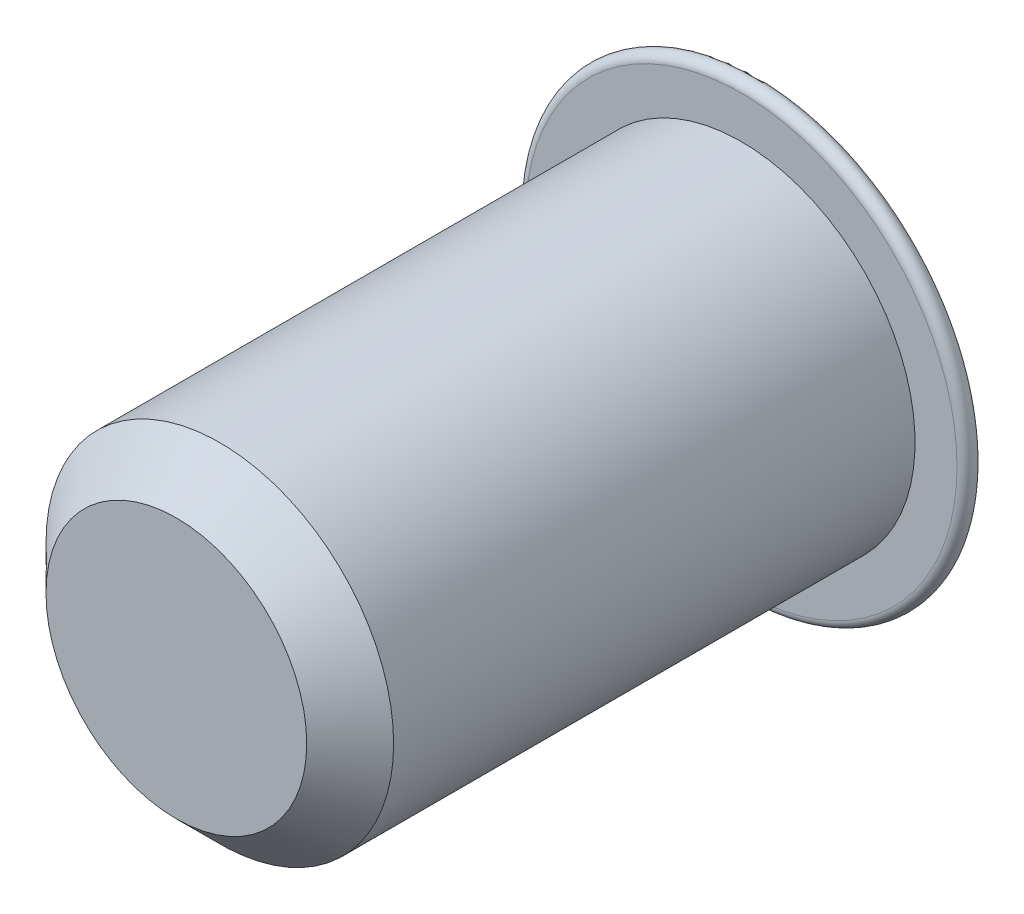
ISO-10303-21;
HEADER;
FILE_DESCRIPTION(('STEP AP214'),'2;1');
FILE_NAME('part.step','',(''),(''),'','','');
FILE_SCHEMA(('AUTOMOTIVE_DESIGN { 1 0 10303 214 1 1 1 1 }'));
ENDSEC;
DATA;
#1=APPLICATION_CONTEXT('core data for automotive mechanical design processes');
#2=APPLICATION_PROTOCOL_DEFINITION('international standard','automotive_design',2000,#1);
#3=PRODUCT_CONTEXT('',#1,'mechanical');
#4=PRODUCT('Part','Part','',(#3));
#5=PRODUCT_RELATED_PRODUCT_CATEGORY('part','',(#4));
#6=PRODUCT_DEFINITION_FORMATION('','',#4);
#7=PRODUCT_DEFINITION_CONTEXT('part definition',#1,'design');
#8=PRODUCT_DEFINITION('design','',#6,#7);
#9=PRODUCT_DEFINITION_SHAPE('','',#8);
#10=(LENGTH_UNIT() NAMED_UNIT(*) SI_UNIT(.MILLI.,.METRE.));
#11=(NAMED_UNIT(*) PLANE_ANGLE_UNIT() SI_UNIT($,.RADIAN.));
#12=(NAMED_UNIT(*) SI_UNIT($,.STERADIAN.) SOLID_ANGLE_UNIT());
#13=UNCERTAINTY_MEASURE_WITH_UNIT(LENGTH_MEASURE(1.E-05),#10,'distance_accuracy_value','');
#14=(GEOMETRIC_REPRESENTATION_CONTEXT(3) GLOBAL_UNCERTAINTY_ASSIGNED_CONTEXT((#13)) GLOBAL_UNIT_ASSIGNED_CONTEXT((#10,
#11,#12)) REPRESENTATION_CONTEXT('',''));
#15=CARTESIAN_POINT('',(0.,0.,0.));
#16=DIRECTION('',(0.,0.,1.));
#17=DIRECTION('',(1.,0.,0.));
#18=AXIS2_PLACEMENT_3D('',#15,#16,#17);
#19=CARTESIAN_POINT('',(2.,0.,0.));
#20=DIRECTION('',(0.,0.,1.));
#21=DIRECTION('',(1.,0.,0.));
#22=AXIS2_PLACEMENT_3D('',#19,#20,#21);
#23=PLANE('',#22);
#24=CARTESIAN_POINT('',(2.,0.,0.));
#25=DIRECTION('',(0.,0.,1.));
#26=DIRECTION('',(1.,0.,0.));
#27=AXIS2_PLACEMENT_3D('',#24,#25,#26);
#28=CIRCLE('',#27,1.5);
#29=CARTESIAN_POINT('',(3.5,0.,0.));
#30=VERTEX_POINT('',#29);
#31=EDGE_CURVE('E74',#30,#30,#28,.T.);
#32=ORIENTED_EDGE('',*,*,#31,.T.);
#33=EDGE_LOOP('',(#32));
#34=FACE_BOUND('',#33,.T.);
#35=ADVANCED_FACE('F35',(#34),#23,.T.);
#36=CARTESIAN_POINT('',(2.,0.,-7.));
#37=CARTESIAN_POINT('',(0.,0.,-7.));
#38=CARTESIAN_POINT('',(-1.,0.,-6.5));
#39=B_SPLINE_CURVE_WITH_KNOTS('',2,(#36,#37,#38),.UNSPECIFIED.,.F.,.F.,(3,3),(0.,1.),.UNSPECIFIED.);
#40=CARTESIAN_POINT('',(2.,0.,-7.));
#41=DIRECTION('',(0.,0.,-1.));
#42=AXIS1_PLACEMENT('',#40,#41);
#43=SURFACE_OF_REVOLUTION('',#39,#42);
#44=CARTESIAN_POINT('',(2.,0.,-6.78041571383782));
#45=DIRECTION('',(0.,0.,-1.));
#46=DIRECTION('',(-1.,0.,0.));
#47=AXIS2_PLACEMENT_3D('',#44,#45,#46);
#48=CIRCLE('',#47,2.21162322583515);
#49=CARTESIAN_POINT('',(0.677236283176382,1.77244843155124,-6.78041571383782));
#50=VERTEX_POINT('',#49);
#51=CARTESIAN_POINT('',(1.17864773030979,2.0534502044433,-6.78041571383782));
#52=VERTEX_POINT('',#51);
#53=EDGE_CURVE('E11',#50,#52,#48,.T.);
#54=ORIENTED_EDGE('',*,*,#53,.F.);
#55=CARTESIAN_POINT('',(2.82135226969021,-2.05345020444329,-6.78041571383782));
#56=CARTESIAN_POINT('',(2.77973524175465,-1.97918998185539,-6.80130277126132));
#57=CARTESIAN_POINT('',(2.7378822968042,-1.90450879576031,-6.82010769101032));
#58=CARTESIAN_POINT('',(2.65384418538508,-1.75455361708886,-6.85407509448601));
#59=CARTESIAN_POINT('',(2.61165919384971,-1.67927993665843,-6.86923937882806));
#60=CARTESIAN_POINT('',(2.52711983399235,-1.5284303447518,-6.89644617456724));
#61=CARTESIAN_POINT('',(2.48476582354909,-1.45285507186404,-6.90849342658713));
#62=CARTESIAN_POINT('',(2.3998914563149,-1.30140770247049,-6.929895260298));
#63=CARTESIAN_POINT('',(2.35737107694972,-1.22553556568384,-6.93924946275567));
#64=CARTESIAN_POINT('',(2.22983188006627,-0.997958306589013,-6.96375054275451));
#65=CARTESIAN_POINT('',(2.14465129405287,-0.845964529250615,-6.9753917335441));
#66=CARTESIAN_POINT('',(1.97411884466448,-0.541671352196947,-6.99133604810537));
#67=CARTESIAN_POINT('',(1.88876694194851,-0.389371882282764,-6.99563723029662));
#68=CARTESIAN_POINT('',(1.78210137102564,-0.199040918441157,-6.99723540136147));
#69=CARTESIAN_POINT('',(1.76079170866424,-0.161016572428727,-6.99736631159937));
#70=CARTESIAN_POINT('',(1.71817255403282,-0.0849681839100069,-6.9972507367857));
#71=CARTESIAN_POINT('',(1.69686306176369,-0.0469441414053054,-6.99700425037265));
#72=CARTESIAN_POINT('',(1.59022028835687,0.143346143207117,-6.99481715583711));
#73=CARTESIAN_POINT('',(1.5048947017147,0.295598655479062,-6.99001157709026));
#74=CARTESIAN_POINT('',(1.33442944630274,0.599771933542551,-6.97293161401377));
#75=CARTESIAN_POINT('',(1.24928973303308,0.751692778738386,-6.96065927458019));
#76=CARTESIAN_POINT('',(1.12343696274311,0.976260826929822,-6.93539898850472));
#77=CARTESIAN_POINT('',(1.08254715027099,1.04922342724913,-6.92607199686214));
#78=CARTESIAN_POINT('',(1.00092828011285,1.19486178169118,-6.90488528918052));
#79=CARTESIAN_POINT('',(0.960199201902872,1.26753757243629,-6.89302590790751));
#80=CARTESIAN_POINT('',(0.87890473626561,1.41259706882174,-6.86639358095784));
#81=CARTESIAN_POINT('',(0.838339673062764,1.48498019592537,-6.85161642288733));
#82=CARTESIAN_POINT('',(0.757521926150688,1.62918904918694,-6.81867561469047));
#83=CARTESIAN_POINT('',(0.717269394188863,1.7010145045712,-6.80051041502449));
#84=CARTESIAN_POINT('',(0.677236283176386,1.77244843155124,-6.78041571383782));
#85=B_SPLINE_CURVE_WITH_KNOTS('',3,(#55,#56,#57,#58,#59,#60,#61,#62,#63,#64,#65,#66,#67,#68,#69,
#70,#71,#72,#73,#74,#75,#76,#77,#78,#79,#80,#81,#82,#83,#84),.UNSPECIFIED.,.F.,.F.,(4,2,2,2,2,2,
2,2,2,2,2,2,2,2,4),(0.,0.262889256183982,0.525648221337983,0.788005181659689,1.05039906884938,
1.5740488194569,2.09783706453605,2.2286021932146,2.35936779363419,2.88303079235302,
3.40655044180104,3.6589919007163,3.91140000908943,4.16417521908661,4.41706632198361),.UNSPECIFIED.);
#86=CARTESIAN_POINT('',(2.82135226969021,-2.0534502044433,-6.78041571383782));
#87=VERTEX_POINT('',#86);
#88=EDGE_CURVE('E39',#87,#50,#85,.T.);
#89=ORIENTED_EDGE('',*,*,#88,.F.);
#90=CARTESIAN_POINT('',(3.32276371682362,-1.77244843155124,-6.78041571383782));
#91=VERTEX_POINT('',#90);
#92=EDGE_CURVE('E51',#91,#87,#48,.T.);
#93=ORIENTED_EDGE('',*,*,#92,.F.);
#94=CARTESIAN_POINT('',(1.17864773030979,2.0534502044433,-6.78041571383782));
#95=CARTESIAN_POINT('',(1.22026194159934,1.97919500779718,-6.80130138540346));
#96=CARTESIAN_POINT('',(1.26211199963574,1.90451897302814,-6.82010514386814));
#97=CARTESIAN_POINT('',(1.34614301263144,1.75457646057843,-6.8540701643467));
#98=CARTESIAN_POINT('',(1.38832378187751,1.67931031427906,-6.86923333790868));
#99=CARTESIAN_POINT('',(1.47286189929371,1.52846293934853,-6.89644085510252));
#100=CARTESIAN_POINT('',(1.51521892900521,1.45288227896574,-6.90848941540002));
#101=CARTESIAN_POINT('',(1.60010018632959,1.30142261509426,-6.92989331915487));
#102=CARTESIAN_POINT('',(1.64262444078268,1.22554356371269,-6.93924821075608));
#103=CARTESIAN_POINT('',(1.77014056018065,0.998007483416377,-6.96374602817808));
#104=CARTESIAN_POINT('',(1.85529581700792,0.8460589027461,-6.9753889652444));
#105=CARTESIAN_POINT('',(1.98316677729883,0.617889654609611,-6.98734128073927));
#106=CARTESIAN_POINT('',(2.02583185807097,0.541759316811918,-6.9904068355411));
#107=CARTESIAN_POINT('',(2.11119339743595,0.389442651539592,-6.99487117934586));
#108=CARTESIAN_POINT('',(2.15388986092778,0.31325631532334,-6.99626959332172));
#109=CARTESIAN_POINT('',(2.25963297836321,0.124571350840693,-6.99787069444988));
#110=CARTESIAN_POINT('',(2.32268306406266,0.0120665990482879,-6.99718621588561));
#111=CARTESIAN_POINT('',(2.44874938003536,-0.212882493891881,-6.99235732334663));
#112=CARTESIAN_POINT('',(2.51176561209529,-0.325326838227758,-6.98821311465033));
#113=CARTESIAN_POINT('',(2.63767267480497,-0.549991764245245,-6.97584516809773));
#114=CARTESIAN_POINT('',(2.70056355449167,-0.662212433426983,-6.96762361285053));
#115=CARTESIAN_POINT('',(2.82602848695872,-0.886088435009936,-6.94635308051359));
#116=CARTESIAN_POINT('',(2.88860292066216,-0.99774444711933,-6.93331370568145));
#117=CARTESIAN_POINT('',(3.01343293709217,-1.22048752286463,-6.90137766721794));
#118=CARTESIAN_POINT('',(3.07568838254051,-1.33157434154523,-6.8824786671016));
#119=CARTESIAN_POINT('',(3.16867367355314,-1.49749460905427,-6.84867876352329));
#120=CARTESIAN_POINT('',(3.1996395844455,-1.55274928603562,-6.8364855424426));
#121=CARTESIAN_POINT('',(3.26136868320953,-1.66289690689567,-6.81004734615797));
#122=CARTESIAN_POINT('',(3.29213181898466,-1.71778975781479,-6.79580186365024));
#123=CARTESIAN_POINT('',(3.32276371682362,-1.77244843155124,-6.78041571383782));
#124=B_SPLINE_CURVE_WITH_KNOTS('',3,(#94,#95,#96,#97,#98,#99,#100,#101,#102,#103,#104,#105,#106,
#107,#108,#109,#110,#111,#112,#113,#114,#115,#116,#117,#118,#119,#120,#121,#122,#123),
.UNSPECIFIED.,.F.,.F.,(4,2,2,2,2,2,2,2,2,2,2,2,2,2,4),(0.,0.262871308140228,0.525604288103345,
0.787979686332083,1.05039907176621,1.57387472511705,1.83583841757554,2.09786102824083,
2.48472589353918,2.87156780636433,3.25820286534506,3.64407145368984,4.03009410276812,
4.22357295380633,4.41709971370546),.UNSPECIFIED.);
#125=EDGE_CURVE('E73',#52,#91,#124,.T.);
#126=ORIENTED_EDGE('',*,*,#125,.F.);
#127=EDGE_LOOP('',(#54,#89,#93,#126));
#128=FACE_BOUND('',#127,.T.);
#129=CARTESIAN_POINT('',(2.,0.,-6.69523809565977));
#130=DIRECTION('',(0.,0.,-1.));
#131=DIRECTION('',(-1.,0.,0.));
#132=AXIS2_PLACEMENT_3D('',#129,#130,#131);
#133=CIRCLE('',#132,2.5133564225944);
#134=CARTESIAN_POINT('',(-0.513356422594399,0.,-6.69523809565977));
#135=VERTEX_POINT('',#134);
#136=EDGE_CURVE('E127',#135,#135,#133,.T.);
#137=ORIENTED_EDGE('',*,*,#136,.T.);
#138=EDGE_LOOP('',(#137));
#139=FACE_BOUND('',#138,.T.);
#140=ADVANCED_FACE('F78',(#128,#139),#43,.F.);
#141=CARTESIAN_POINT('',(0.,0.,-6.5));
#142=DIRECTION('',(0.,0.,1.));
#143=DIRECTION('',(1.,0.,0.));
#144=AXIS2_PLACEMENT_3D('',#141,#142,#143);
#145=PLANE('',#144);
#146=CARTESIAN_POINT('',(2.,0.,-6.5));
#147=DIRECTION('',(0.,0.,1.));
#148=DIRECTION('',(1.,0.,0.));
#149=AXIS2_PLACEMENT_3D('',#146,#147,#148);
#150=CIRCLE('',#149,2.4828653561142);
#151=CARTESIAN_POINT('',(4.4828653561142,0.,-6.5));
#152=VERTEX_POINT('',#151);
#153=EDGE_CURVE('E124',#152,#152,#150,.T.);
#154=ORIENTED_EDGE('',*,*,#153,.T.);
#155=EDGE_LOOP('',(#154));
#156=FACE_BOUND('',#155,.T.);
#157=CARTESIAN_POINT('',(2.,0.,-6.5));
#158=DIRECTION('',(0.,0.,-1.));
#159=DIRECTION('',(-1.,0.,0.));
#160=AXIS2_PLACEMENT_3D('',#157,#158,#159);
#161=CIRCLE('',#160,2.);
#162=CARTESIAN_POINT('',(0.,0.,-6.5));
#163=VERTEX_POINT('',#162);
#164=EDGE_CURVE('E128',#163,#163,#161,.T.);
#165=ORIENTED_EDGE('',*,*,#164,.T.);
#166=EDGE_LOOP('',(#165));
#167=FACE_BOUND('',#166,.T.);
#168=ADVANCED_FACE('F102',(#156,#167),#145,.T.);
#169=CARTESIAN_POINT('',(2.,0.,-7.));
#170=DIRECTION('',(0.,0.,-1.));
#171=DIRECTION('',(-1.,0.,0.));
#172=AXIS2_PLACEMENT_3D('',#169,#170,#171);
#173=CYLINDRICAL_SURFACE('',#172,2.);
#174=CARTESIAN_POINT('',(2.,0.,-0.5));
#175=DIRECTION('',(0.,0.,1.));
#176=DIRECTION('',(1.,0.,0.));
#177=AXIS2_PLACEMENT_3D('',#174,#175,#176);
#178=CIRCLE('',#177,2.);
#179=CARTESIAN_POINT('',(4.,0.,-0.5));
#180=VERTEX_POINT('',#179);
#181=EDGE_CURVE('E130',#180,#180,#178,.F.);
#182=ORIENTED_EDGE('',*,*,#181,.T.);
#183=EDGE_LOOP('',(#182));
#184=FACE_BOUND('',#183,.T.);
#185=ORIENTED_EDGE('',*,*,#164,.F.);
#186=EDGE_LOOP('',(#185));
#187=FACE_BOUND('',#186,.T.);
#188=ADVANCED_FACE('F99',(#184,#187),#173,.T.);
#189=CARTESIAN_POINT('',(2.,0.,-6.6));
#190=DIRECTION('',(0.,0.,-1.));
#191=DIRECTION('',(-1.,0.,0.));
#192=AXIS2_PLACEMENT_3D('',#189,#190,#191);
#193=TOROIDAL_SURFACE('',#192,2.4828653561142,0.1);
#194=ORIENTED_EDGE('',*,*,#153,.F.);
#195=EDGE_LOOP('',(#194));
#196=FACE_BOUND('',#195,.T.);
#197=ORIENTED_EDGE('',*,*,#136,.F.);
#198=EDGE_LOOP('',(#197));
#199=FACE_BOUND('',#198,.T.);
#200=ADVANCED_FACE('F101',(#196,#199),#193,.T.);
#201=CARTESIAN_POINT('',(2.,0.,-0.5));
#202=DIRECTION('',(0.,0.,-1.));
#203=DIRECTION('',(-1.,0.,0.));
#204=AXIS2_PLACEMENT_3D('',#201,#202,#203);
#205=CONICAL_SURFACE('',#204,2.,0.78539816339745);
#206=ORIENTED_EDGE('',*,*,#31,.F.);
#207=EDGE_LOOP('',(#206));
#208=FACE_BOUND('',#207,.T.);
#209=ORIENTED_EDGE('',*,*,#181,.F.);
#210=EDGE_LOOP('',(#209));
#211=FACE_BOUND('',#210,.T.);
#212=ADVANCED_FACE('F37',(#208,#211),#205,.T.);
#213=CARTESIAN_POINT('',(6.63812708822096,-8.86399294744937,-8.13243435567065));
#214=DIRECTION('',(-0.872349206100334,-0.488883281178766,0.));
#215=DIRECTION('',(0.488883281178766,-0.872349206100334,0.));
#216=AXIS2_PLACEMENT_3D('',#213,#214,#215);
#217=PLANE('',#216);
#218=ORIENTED_EDGE('',*,*,#88,.T.);
#219=DIRECTION('',(-0.488883281178766,0.872349206100334,0.));
#220=VECTOR('',#219,1.);
#221=CARTESIAN_POINT('',(6.63812708822096,-8.86399294744937,-6.78041571383782));
#222=LINE('',#221,#220);
#223=EDGE_CURVE('E69',#87,#50,#222,.T.);
#224=ORIENTED_EDGE('',*,*,#223,.F.);
#225=EDGE_LOOP('',(#218,#224));
#226=FACE_BOUND('',#225,.T.);
#227=ADVANCED_FACE('F76',(#226),#217,.F.);
#228=CARTESIAN_POINT('',(7.13953853535436,-8.58299117455731,-8.13243435567065));
#229=DIRECTION('',(0.872349206100334,0.488883281178766,0.));
#230=DIRECTION('',(-0.488883281178766,0.872349206100334,0.));
#231=AXIS2_PLACEMENT_3D('',#228,#229,#230);
#232=PLANE('',#231);
#233=ORIENTED_EDGE('',*,*,#125,.T.);
#234=DIRECTION('',(-0.488883281178766,0.872349206100334,0.));
#235=VECTOR('',#234,1.);
#236=CARTESIAN_POINT('',(7.13953853535436,-8.58299117455731,-6.78041571383782));
#237=LINE('',#236,#235);
#238=EDGE_CURVE('E57',#91,#52,#237,.T.);
#239=ORIENTED_EDGE('',*,*,#238,.T.);
#240=EDGE_LOOP('',(#233,#239));
#241=FACE_BOUND('',#240,.T.);
#242=ADVANCED_FACE('F91',(#241),#232,.F.);
#243=CARTESIAN_POINT('',(7.13953853535436,-8.58299117455731,-6.78041571383782));
#244=DIRECTION('',(0.,0.,1.));
#245=DIRECTION('',(0.,-1.,0.));
#246=AXIS2_PLACEMENT_3D('',#243,#244,#245);
#247=PLANE('',#246);
#248=ORIENTED_EDGE('',*,*,#53,.T.);
#249=ORIENTED_EDGE('',*,*,#238,.F.);
#250=ORIENTED_EDGE('',*,*,#92,.T.);
#251=ORIENTED_EDGE('',*,*,#223,.T.);
#252=EDGE_LOOP('',(#248,#249,#250,#251));
#253=FACE_BOUND('',#252,.T.);
#254=ADVANCED_FACE('F68',(#253),#247,.F.);
#255=CLOSED_SHELL('',(#35,#140,#168,#188,#200,#212,#227,#242,#254));
#256=MANIFOLD_SOLID_BREP('B2',#255);
#257=ADVANCED_BREP_SHAPE_REPRESENTATION('',(#18,#256),#14);
#258=SHAPE_DEFINITION_REPRESENTATION(#9,#257);
ENDSEC;
END-ISO-10303-21;
